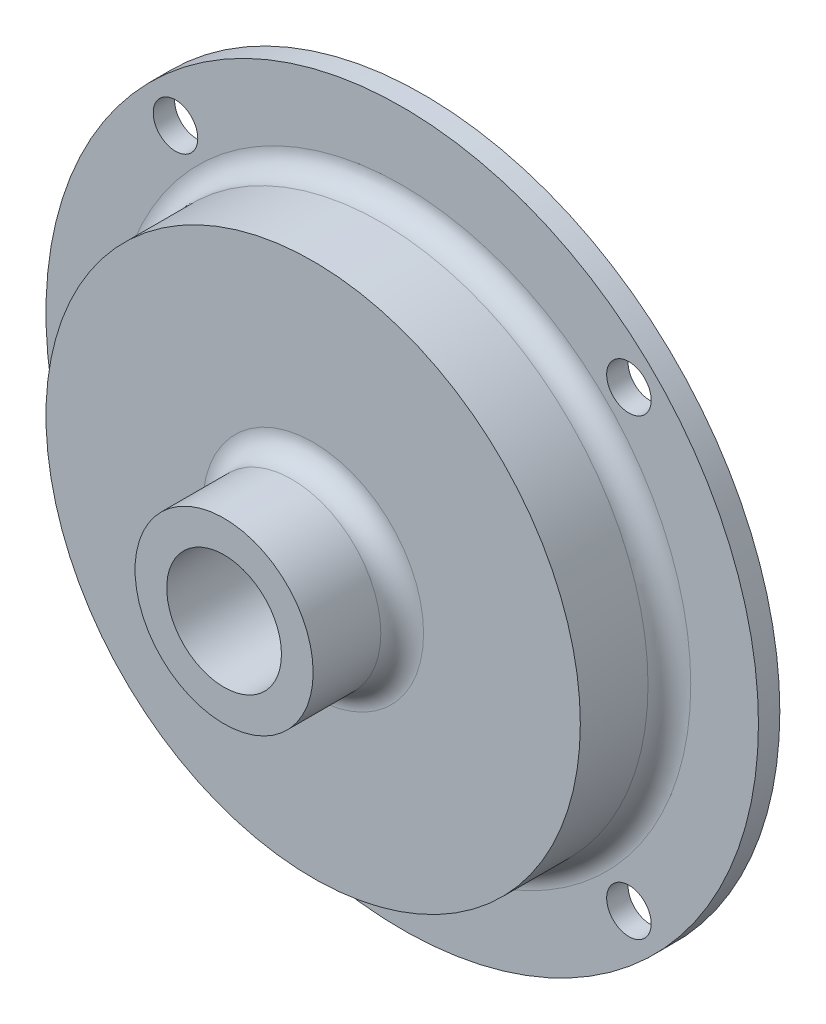
ISO-10303-21;
HEADER;
FILE_DESCRIPTION(('STEP AP214'),'2;1');
FILE_NAME('part.step','',(''),(''),'','','');
FILE_SCHEMA(('AUTOMOTIVE_DESIGN { 1 0 10303 214 1 1 1 1 }'));
ENDSEC;
DATA;
#1=APPLICATION_CONTEXT('core data for automotive mechanical design processes');
#2=APPLICATION_PROTOCOL_DEFINITION('international standard','automotive_design',2000,#1);
#3=PRODUCT_CONTEXT('',#1,'mechanical');
#4=PRODUCT('Part','Part','',(#3));
#5=PRODUCT_RELATED_PRODUCT_CATEGORY('part','',(#4));
#6=PRODUCT_DEFINITION_FORMATION('','',#4);
#7=PRODUCT_DEFINITION_CONTEXT('part definition',#1,'design');
#8=PRODUCT_DEFINITION('design','',#6,#7);
#9=PRODUCT_DEFINITION_SHAPE('','',#8);
#10=(LENGTH_UNIT() NAMED_UNIT(*) SI_UNIT(.MILLI.,.METRE.));
#11=(NAMED_UNIT(*) PLANE_ANGLE_UNIT() SI_UNIT($,.RADIAN.));
#12=(NAMED_UNIT(*) SI_UNIT($,.STERADIAN.) SOLID_ANGLE_UNIT());
#13=UNCERTAINTY_MEASURE_WITH_UNIT(LENGTH_MEASURE(1.E-05),#10,'distance_accuracy_value','');
#14=(GEOMETRIC_REPRESENTATION_CONTEXT(3) GLOBAL_UNCERTAINTY_ASSIGNED_CONTEXT((#13)) GLOBAL_UNIT_ASSIGNED_CONTEXT((#10,
#11,#12)) REPRESENTATION_CONTEXT('',''));
#15=CARTESIAN_POINT('',(0.,0.,0.));
#16=DIRECTION('',(0.,0.,1.));
#17=DIRECTION('',(1.,0.,0.));
#18=AXIS2_PLACEMENT_3D('',#15,#16,#17);
#19=CARTESIAN_POINT('',(0.,0.,15.5));
#20=DIRECTION('',(0.,0.,1.));
#21=DIRECTION('',(1.,0.,0.));
#22=AXIS2_PLACEMENT_3D('',#19,#20,#21);
#23=PLANE('',#22);
#24=CARTESIAN_POINT('',(0.,0.,15.5));
#25=DIRECTION('',(0.,0.,1.));
#26=DIRECTION('',(1.,0.,0.));
#27=AXIS2_PLACEMENT_3D('',#24,#25,#26);
#28=CIRCLE('',#27,15.5);
#29=CARTESIAN_POINT('',(15.5,0.,15.5));
#30=VERTEX_POINT('',#29);
#31=EDGE_CURVE('E43',#30,#30,#28,.F.);
#32=ORIENTED_EDGE('',*,*,#31,.T.);
#33=EDGE_LOOP('',(#32));
#34=FACE_BOUND('',#33,.T.);
#35=CARTESIAN_POINT('',(0.,0.,15.5));
#36=DIRECTION('',(0.,0.,1.));
#37=DIRECTION('',(1.,0.,0.));
#38=AXIS2_PLACEMENT_3D('',#35,#36,#37);
#39=CIRCLE('',#38,37.5);
#40=CARTESIAN_POINT('',(37.5,0.,15.5));
#41=VERTEX_POINT('',#40);
#42=EDGE_CURVE('E80',#41,#41,#39,.T.);
#43=ORIENTED_EDGE('',*,*,#42,.T.);
#44=EDGE_LOOP('',(#43));
#45=FACE_BOUND('',#44,.T.);
#46=ADVANCED_FACE('F32',(#34,#45),#23,.T.);
#47=CARTESIAN_POINT('',(0.,0.,3.));
#48=DIRECTION('',(0.,0.,1.));
#49=DIRECTION('',(1.,0.,0.));
#50=AXIS2_PLACEMENT_3D('',#47,#48,#49);
#51=PLANE('',#50);
#52=CARTESIAN_POINT('',(0.,0.,3.));
#53=DIRECTION('',(0.,0.,1.));
#54=DIRECTION('',(1.,0.,0.));
#55=AXIS2_PLACEMENT_3D('',#52,#53,#54);
#56=CIRCLE('',#55,40.5);
#57=CARTESIAN_POINT('',(40.5,0.,3.));
#58=VERTEX_POINT('',#57);
#59=EDGE_CURVE('E10',#58,#58,#56,.F.);
#60=ORIENTED_EDGE('',*,*,#59,.T.);
#61=EDGE_LOOP('',(#60));
#62=FACE_BOUND('',#61,.T.);
#63=CARTESIAN_POINT('',(-31.8198051533947,31.8198051533946,3.));
#64=DIRECTION('',(0.,0.,1.));
#65=DIRECTION('',(1.,0.,0.));
#66=AXIS2_PLACEMENT_3D('',#63,#64,#65);
#67=CIRCLE('',#66,3.125);
#68=CARTESIAN_POINT('',(-28.6948051533947,31.8198051533946,3.));
#69=VERTEX_POINT('',#68);
#70=EDGE_CURVE('E74',#69,#69,#67,.T.);
#71=ORIENTED_EDGE('',*,*,#70,.F.);
#72=EDGE_LOOP('',(#71));
#73=FACE_BOUND('',#72,.T.);
#74=CARTESIAN_POINT('',(-31.8198051533946,-31.8198051533947,3.));
#75=DIRECTION('',(0.,0.,1.));
#76=DIRECTION('',(1.,0.,0.));
#77=AXIS2_PLACEMENT_3D('',#74,#75,#76);
#78=CIRCLE('',#77,3.125);
#79=CARTESIAN_POINT('',(-28.6948051533946,-31.8198051533947,3.));
#80=VERTEX_POINT('',#79);
#81=EDGE_CURVE('E62',#80,#80,#78,.T.);
#82=ORIENTED_EDGE('',*,*,#81,.F.);
#83=EDGE_LOOP('',(#82));
#84=FACE_BOUND('',#83,.T.);
#85=CARTESIAN_POINT('',(0.,0.,3.));
#86=DIRECTION('',(0.,0.,1.));
#87=DIRECTION('',(1.,0.,0.));
#88=AXIS2_PLACEMENT_3D('',#85,#86,#87);
#89=CIRCLE('',#88,50.);
#90=CARTESIAN_POINT('',(50.,0.,3.));
#91=VERTEX_POINT('',#90);
#92=EDGE_CURVE('E52',#91,#91,#89,.T.);
#93=ORIENTED_EDGE('',*,*,#92,.T.);
#94=EDGE_LOOP('',(#93));
#95=FACE_BOUND('',#94,.T.);
#96=CARTESIAN_POINT('',(31.8198051533946,31.8198051533947,3.));
#97=DIRECTION('',(0.,0.,1.));
#98=DIRECTION('',(1.,0.,0.));
#99=AXIS2_PLACEMENT_3D('',#96,#97,#98);
#100=CIRCLE('',#99,3.125);
#101=CARTESIAN_POINT('',(34.9448051533946,31.8198051533947,3.));
#102=VERTEX_POINT('',#101);
#103=EDGE_CURVE('E56',#102,#102,#100,.T.);
#104=ORIENTED_EDGE('',*,*,#103,.F.);
#105=EDGE_LOOP('',(#104));
#106=FACE_BOUND('',#105,.T.);
#107=CARTESIAN_POINT('',(31.8198051533947,-31.8198051533946,3.));
#108=DIRECTION('',(0.,0.,1.));
#109=DIRECTION('',(1.,0.,0.));
#110=AXIS2_PLACEMENT_3D('',#107,#108,#109);
#111=CIRCLE('',#110,3.125);
#112=CARTESIAN_POINT('',(34.9448051533947,-31.8198051533946,3.));
#113=VERTEX_POINT('',#112);
#114=EDGE_CURVE('E68',#113,#113,#111,.T.);
#115=ORIENTED_EDGE('',*,*,#114,.F.);
#116=EDGE_LOOP('',(#115));
#117=FACE_BOUND('',#116,.T.);
#118=ADVANCED_FACE('F123',(#62,#73,#84,#95,#106,#117),#51,.T.);
#119=CARTESIAN_POINT('',(0.,0.,0.));
#120=DIRECTION('',(0.,0.,1.));
#121=DIRECTION('',(1.,0.,0.));
#122=AXIS2_PLACEMENT_3D('',#119,#120,#121);
#123=PLANE('',#122);
#124=CARTESIAN_POINT('',(0.,0.,0.));
#125=DIRECTION('',(0.,0.,1.));
#126=DIRECTION('',(1.,0.,0.));
#127=AXIS2_PLACEMENT_3D('',#124,#125,#126);
#128=CIRCLE('',#127,8.05);
#129=CARTESIAN_POINT('',(8.05,0.,0.));
#130=VERTEX_POINT('',#129);
#131=EDGE_CURVE('E88',#130,#130,#128,.T.);
#132=ORIENTED_EDGE('',*,*,#131,.T.);
#133=EDGE_LOOP('',(#132));
#134=FACE_BOUND('',#133,.T.);
#135=CARTESIAN_POINT('',(31.8198051533947,-31.8198051533946,0.));
#136=DIRECTION('',(0.,0.,1.));
#137=DIRECTION('',(1.,0.,0.));
#138=AXIS2_PLACEMENT_3D('',#135,#136,#137);
#139=CIRCLE('',#138,3.125);
#140=CARTESIAN_POINT('',(34.9448051533947,-31.8198051533946,0.));
#141=VERTEX_POINT('',#140);
#142=EDGE_CURVE('E71',#141,#141,#139,.T.);
#143=ORIENTED_EDGE('',*,*,#142,.T.);
#144=EDGE_LOOP('',(#143));
#145=FACE_BOUND('',#144,.T.);
#146=CARTESIAN_POINT('',(31.8198051533946,31.8198051533947,0.));
#147=DIRECTION('',(0.,0.,1.));
#148=DIRECTION('',(1.,0.,0.));
#149=AXIS2_PLACEMENT_3D('',#146,#147,#148);
#150=CIRCLE('',#149,3.125);
#151=CARTESIAN_POINT('',(34.9448051533946,31.8198051533947,0.));
#152=VERTEX_POINT('',#151);
#153=EDGE_CURVE('E59',#152,#152,#150,.T.);
#154=ORIENTED_EDGE('',*,*,#153,.T.);
#155=EDGE_LOOP('',(#154));
#156=FACE_BOUND('',#155,.T.);
#157=CARTESIAN_POINT('',(0.,0.,0.));
#158=DIRECTION('',(0.,0.,1.));
#159=DIRECTION('',(1.,0.,0.));
#160=AXIS2_PLACEMENT_3D('',#157,#158,#159);
#161=CIRCLE('',#160,50.);
#162=CARTESIAN_POINT('',(50.,0.,0.));
#163=VERTEX_POINT('',#162);
#164=EDGE_CURVE('E53',#163,#163,#161,.T.);
#165=ORIENTED_EDGE('',*,*,#164,.F.);
#166=EDGE_LOOP('',(#165));
#167=FACE_BOUND('',#166,.T.);
#168=CARTESIAN_POINT('',(-31.8198051533946,-31.8198051533947,0.));
#169=DIRECTION('',(0.,0.,1.));
#170=DIRECTION('',(1.,0.,0.));
#171=AXIS2_PLACEMENT_3D('',#168,#169,#170);
#172=CIRCLE('',#171,3.125);
#173=CARTESIAN_POINT('',(-28.6948051533946,-31.8198051533947,0.));
#174=VERTEX_POINT('',#173);
#175=EDGE_CURVE('E65',#174,#174,#172,.T.);
#176=ORIENTED_EDGE('',*,*,#175,.T.);
#177=EDGE_LOOP('',(#176));
#178=FACE_BOUND('',#177,.T.);
#179=CARTESIAN_POINT('',(-31.8198051533947,31.8198051533946,0.));
#180=DIRECTION('',(0.,0.,1.));
#181=DIRECTION('',(1.,0.,0.));
#182=AXIS2_PLACEMENT_3D('',#179,#180,#181);
#183=CIRCLE('',#182,3.125);
#184=CARTESIAN_POINT('',(-28.6948051533947,31.8198051533946,0.));
#185=VERTEX_POINT('',#184);
#186=EDGE_CURVE('E77',#185,#185,#183,.T.);
#187=ORIENTED_EDGE('',*,*,#186,.T.);
#188=EDGE_LOOP('',(#187));
#189=FACE_BOUND('',#188,.T.);
#190=ADVANCED_FACE('F95',(#134,#145,#156,#167,#178,#189),#123,.F.);
#191=CARTESIAN_POINT('',(0.,0.,3.));
#192=DIRECTION('',(0.,0.,-1.));
#193=DIRECTION('',(-1.,0.,0.));
#194=AXIS2_PLACEMENT_3D('',#191,#192,#193);
#195=CYLINDRICAL_SURFACE('',#194,50.);
#196=ORIENTED_EDGE('',*,*,#92,.F.);
#197=EDGE_LOOP('',(#196));
#198=FACE_BOUND('',#197,.T.);
#199=ORIENTED_EDGE('',*,*,#164,.T.);
#200=EDGE_LOOP('',(#199));
#201=FACE_BOUND('',#200,.T.);
#202=ADVANCED_FACE('F144',(#198,#201),#195,.T.);
#203=CARTESIAN_POINT('',(31.8198051533946,31.8198051533947,3.));
#204=DIRECTION('',(0.,0.,-1.));
#205=DIRECTION('',(-1.,0.,0.));
#206=AXIS2_PLACEMENT_3D('',#203,#204,#205);
#207=CYLINDRICAL_SURFACE('',#206,3.125);
#208=ORIENTED_EDGE('',*,*,#103,.T.);
#209=EDGE_LOOP('',(#208));
#210=FACE_BOUND('',#209,.T.);
#211=ORIENTED_EDGE('',*,*,#153,.F.);
#212=EDGE_LOOP('',(#211));
#213=FACE_BOUND('',#212,.T.);
#214=ADVANCED_FACE('F141',(#210,#213),#207,.F.);
#215=CARTESIAN_POINT('',(-31.8198051533946,-31.8198051533947,3.));
#216=DIRECTION('',(0.,0.,-1.));
#217=DIRECTION('',(-1.,0.,0.));
#218=AXIS2_PLACEMENT_3D('',#215,#216,#217);
#219=CYLINDRICAL_SURFACE('',#218,3.125);
#220=ORIENTED_EDGE('',*,*,#81,.T.);
#221=EDGE_LOOP('',(#220));
#222=FACE_BOUND('',#221,.T.);
#223=ORIENTED_EDGE('',*,*,#175,.F.);
#224=EDGE_LOOP('',(#223));
#225=FACE_BOUND('',#224,.T.);
#226=ADVANCED_FACE('F137',(#222,#225),#219,.F.);
#227=CARTESIAN_POINT('',(31.8198051533947,-31.8198051533946,3.));
#228=DIRECTION('',(0.,0.,-1.));
#229=DIRECTION('',(-1.,0.,0.));
#230=AXIS2_PLACEMENT_3D('',#227,#228,#229);
#231=CYLINDRICAL_SURFACE('',#230,3.125);
#232=ORIENTED_EDGE('',*,*,#114,.T.);
#233=EDGE_LOOP('',(#232));
#234=FACE_BOUND('',#233,.T.);
#235=ORIENTED_EDGE('',*,*,#142,.F.);
#236=EDGE_LOOP('',(#235));
#237=FACE_BOUND('',#236,.T.);
#238=ADVANCED_FACE('F133',(#234,#237),#231,.F.);
#239=CARTESIAN_POINT('',(-31.8198051533947,31.8198051533946,3.));
#240=DIRECTION('',(0.,0.,-1.));
#241=DIRECTION('',(-1.,0.,0.));
#242=AXIS2_PLACEMENT_3D('',#239,#240,#241);
#243=CYLINDRICAL_SURFACE('',#242,3.125);
#244=ORIENTED_EDGE('',*,*,#70,.T.);
#245=EDGE_LOOP('',(#244));
#246=FACE_BOUND('',#245,.T.);
#247=ORIENTED_EDGE('',*,*,#186,.F.);
#248=EDGE_LOOP('',(#247));
#249=FACE_BOUND('',#248,.T.);
#250=ADVANCED_FACE('F119',(#246,#249),#243,.F.);
#251=CARTESIAN_POINT('',(0.,0.,15.5));
#252=DIRECTION('',(0.,0.,-1.));
#253=DIRECTION('',(-1.,0.,0.));
#254=AXIS2_PLACEMENT_3D('',#251,#252,#253);
#255=CYLINDRICAL_SURFACE('',#254,37.5);
#256=CARTESIAN_POINT('',(0.,0.,6.));
#257=DIRECTION('',(0.,0.,1.));
#258=DIRECTION('',(1.,0.,0.));
#259=AXIS2_PLACEMENT_3D('',#256,#257,#258);
#260=CIRCLE('',#259,37.5);
#261=CARTESIAN_POINT('',(37.5,0.,6.));
#262=VERTEX_POINT('',#261);
#263=EDGE_CURVE('E39',#262,#262,#260,.T.);
#264=ORIENTED_EDGE('',*,*,#263,.T.);
#265=EDGE_LOOP('',(#264));
#266=FACE_BOUND('',#265,.T.);
#267=ORIENTED_EDGE('',*,*,#42,.F.);
#268=EDGE_LOOP('',(#267));
#269=FACE_BOUND('',#268,.T.);
#270=ADVANCED_FACE('F113',(#266,#269),#255,.T.);
#271=CARTESIAN_POINT('',(0.,0.,28.));
#272=DIRECTION('',(0.,0.,-1.));
#273=DIRECTION('',(-1.,0.,0.));
#274=AXIS2_PLACEMENT_3D('',#271,#272,#273);
#275=CYLINDRICAL_SURFACE('',#274,12.5);
#276=CARTESIAN_POINT('',(0.,0.,18.5));
#277=DIRECTION('',(0.,0.,1.));
#278=DIRECTION('',(1.,0.,0.));
#279=AXIS2_PLACEMENT_3D('',#276,#277,#278);
#280=CIRCLE('',#279,12.5);
#281=CARTESIAN_POINT('',(12.5,0.,18.5));
#282=VERTEX_POINT('',#281);
#283=EDGE_CURVE('E47',#282,#282,#280,.T.);
#284=ORIENTED_EDGE('',*,*,#283,.T.);
#285=EDGE_LOOP('',(#284));
#286=FACE_BOUND('',#285,.T.);
#287=CARTESIAN_POINT('',(0.,0.,28.));
#288=DIRECTION('',(0.,0.,1.));
#289=DIRECTION('',(1.,0.,0.));
#290=AXIS2_PLACEMENT_3D('',#287,#288,#289);
#291=CIRCLE('',#290,12.5);
#292=CARTESIAN_POINT('',(12.5,0.,28.));
#293=VERTEX_POINT('',#292);
#294=EDGE_CURVE('E85',#293,#293,#291,.T.);
#295=ORIENTED_EDGE('',*,*,#294,.F.);
#296=EDGE_LOOP('',(#295));
#297=FACE_BOUND('',#296,.T.);
#298=ADVANCED_FACE('F108',(#286,#297),#275,.T.);
#299=CARTESIAN_POINT('',(0.,0.,28.));
#300=DIRECTION('',(0.,0.,1.));
#301=DIRECTION('',(1.,0.,0.));
#302=AXIS2_PLACEMENT_3D('',#299,#300,#301);
#303=PLANE('',#302);
#304=CARTESIAN_POINT('',(0.,0.,28.));
#305=DIRECTION('',(0.,0.,1.));
#306=DIRECTION('',(1.,0.,0.));
#307=AXIS2_PLACEMENT_3D('',#304,#305,#306);
#308=CIRCLE('',#307,8.05);
#309=CARTESIAN_POINT('',(8.05,0.,28.));
#310=VERTEX_POINT('',#309);
#311=EDGE_CURVE('E89',#310,#310,#308,.T.);
#312=ORIENTED_EDGE('',*,*,#311,.F.);
#313=EDGE_LOOP('',(#312));
#314=FACE_BOUND('',#313,.T.);
#315=ORIENTED_EDGE('',*,*,#294,.T.);
#316=EDGE_LOOP('',(#315));
#317=FACE_BOUND('',#316,.T.);
#318=ADVANCED_FACE('F104',(#314,#317),#303,.T.);
#319=CARTESIAN_POINT('',(0.,0.,18.5));
#320=DIRECTION('',(0.,0.,1.));
#321=DIRECTION('',(1.,0.,0.));
#322=AXIS2_PLACEMENT_3D('',#319,#320,#321);
#323=TOROIDAL_SURFACE('',#322,15.5,3.);
#324=ORIENTED_EDGE('',*,*,#31,.F.);
#325=EDGE_LOOP('',(#324));
#326=FACE_BOUND('',#325,.T.);
#327=ORIENTED_EDGE('',*,*,#283,.F.);
#328=EDGE_LOOP('',(#327));
#329=FACE_BOUND('',#328,.T.);
#330=ADVANCED_FACE('F107',(#326,#329),#323,.F.);
#331=CARTESIAN_POINT('',(0.,0.,6.));
#332=DIRECTION('',(0.,0.,1.));
#333=DIRECTION('',(1.,0.,0.));
#334=AXIS2_PLACEMENT_3D('',#331,#332,#333);
#335=TOROIDAL_SURFACE('',#334,40.5,3.);
#336=ORIENTED_EDGE('',*,*,#59,.F.);
#337=EDGE_LOOP('',(#336));
#338=FACE_BOUND('',#337,.T.);
#339=ORIENTED_EDGE('',*,*,#263,.F.);
#340=EDGE_LOOP('',(#339));
#341=FACE_BOUND('',#340,.T.);
#342=ADVANCED_FACE('F34',(#338,#341),#335,.F.);
#343=CARTESIAN_POINT('',(0.,0.,0.));
#344=DIRECTION('',(0.,0.,1.));
#345=DIRECTION('',(1.,0.,0.));
#346=AXIS2_PLACEMENT_3D('',#343,#344,#345);
#347=CYLINDRICAL_SURFACE('',#346,8.05);
#348=ORIENTED_EDGE('',*,*,#131,.F.);
#349=EDGE_LOOP('',(#348));
#350=FACE_BOUND('',#349,.T.);
#351=ORIENTED_EDGE('',*,*,#311,.T.);
#352=EDGE_LOOP('',(#351));
#353=FACE_BOUND('',#352,.T.);
#354=ADVANCED_FACE('F98',(#350,#353),#347,.F.);
#355=CLOSED_SHELL('',(#46,#118,#190,#202,#214,#226,#238,#250,#270,#298,#318,#330,#342,#354));
#356=MANIFOLD_SOLID_BREP('B2',#355);
#357=ADVANCED_BREP_SHAPE_REPRESENTATION('',(#18,#356),#14);
#358=SHAPE_DEFINITION_REPRESENTATION(#9,#357);
ENDSEC;
END-ISO-10303-21;
